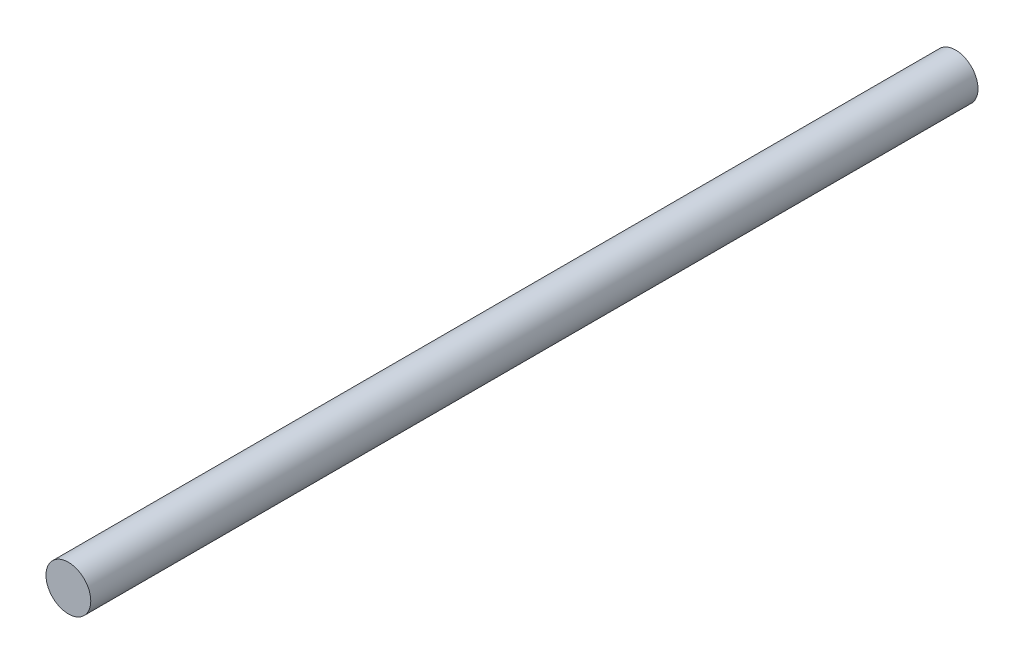
ISO-10303-21;
HEADER;
FILE_DESCRIPTION(('STEP AP214'),'2;1');
FILE_NAME('part.step','',(''),(''),'','','');
FILE_SCHEMA(('AUTOMOTIVE_DESIGN { 1 0 10303 214 1 1 1 1 }'));
ENDSEC;
DATA;
#1=APPLICATION_CONTEXT('core data for automotive mechanical design processes');
#2=APPLICATION_PROTOCOL_DEFINITION('international standard','automotive_design',2000,#1);
#3=PRODUCT_CONTEXT('',#1,'mechanical');
#4=PRODUCT('Part','Part','',(#3));
#5=PRODUCT_RELATED_PRODUCT_CATEGORY('part','',(#4));
#6=PRODUCT_DEFINITION_FORMATION('','',#4);
#7=PRODUCT_DEFINITION_CONTEXT('part definition',#1,'design');
#8=PRODUCT_DEFINITION('design','',#6,#7);
#9=PRODUCT_DEFINITION_SHAPE('','',#8);
#10=(LENGTH_UNIT() NAMED_UNIT(*) SI_UNIT(.MILLI.,.METRE.));
#11=(NAMED_UNIT(*) PLANE_ANGLE_UNIT() SI_UNIT($,.RADIAN.));
#12=(NAMED_UNIT(*) SI_UNIT($,.STERADIAN.) SOLID_ANGLE_UNIT());
#13=UNCERTAINTY_MEASURE_WITH_UNIT(LENGTH_MEASURE(1.E-05),#10,'distance_accuracy_value','');
#14=(GEOMETRIC_REPRESENTATION_CONTEXT(3) GLOBAL_UNCERTAINTY_ASSIGNED_CONTEXT((#13)) GLOBAL_UNIT_ASSIGNED_CONTEXT((#10,
#11,#12)) REPRESENTATION_CONTEXT('',''));
#15=CARTESIAN_POINT('',(0.,0.,0.));
#16=DIRECTION('',(0.,0.,1.));
#17=DIRECTION('',(1.,0.,0.));
#18=AXIS2_PLACEMENT_3D('',#15,#16,#17);
#19=CARTESIAN_POINT('',(0.,0.,-70.3804718998415));
#20=DIRECTION('',(0.,0.,1.));
#21=DIRECTION('',(1.,0.,0.));
#22=AXIS2_PLACEMENT_3D('',#19,#20,#21);
#23=CYLINDRICAL_SURFACE('',#22,1.778);
#24=CARTESIAN_POINT('',(0.,0.,-70.3804718998415));
#25=DIRECTION('',(0.,0.,1.));
#26=DIRECTION('',(1.,0.,0.));
#27=AXIS2_PLACEMENT_3D('',#24,#25,#26);
#28=CIRCLE('',#27,1.778);
#29=CARTESIAN_POINT('',(1.778,0.,-70.3804718998415));
#30=VERTEX_POINT('',#29);
#31=EDGE_CURVE('E11',#30,#30,#28,.T.);
#32=ORIENTED_EDGE('',*,*,#31,.T.);
#33=EDGE_LOOP('',(#32));
#34=FACE_BOUND('',#33,.T.);
#35=CARTESIAN_POINT('',(0.,0.,0.));
#36=DIRECTION('',(0.,0.,1.));
#37=DIRECTION('',(1.,0.,0.));
#38=AXIS2_PLACEMENT_3D('',#35,#36,#37);
#39=CIRCLE('',#38,1.778);
#40=CARTESIAN_POINT('',(1.778,0.,0.));
#41=VERTEX_POINT('',#40);
#42=EDGE_CURVE('E53',#41,#41,#39,.T.);
#43=ORIENTED_EDGE('',*,*,#42,.F.);
#44=EDGE_LOOP('',(#43));
#45=FACE_BOUND('',#44,.T.);
#46=ADVANCED_FACE('F50',(#34,#45),#23,.T.);
#47=CARTESIAN_POINT('',(0.,0.,-70.3804718998415));
#48=DIRECTION('',(0.,0.,1.));
#49=DIRECTION('',(1.,0.,0.));
#50=AXIS2_PLACEMENT_3D('',#47,#48,#49);
#51=PLANE('',#50);
#52=ORIENTED_EDGE('',*,*,#31,.F.);
#53=EDGE_LOOP('',(#52));
#54=FACE_BOUND('',#53,.T.);
#55=ADVANCED_FACE('F68',(#54),#51,.F.);
#56=CARTESIAN_POINT('',(0.,0.,0.));
#57=DIRECTION('',(0.,0.,1.));
#58=DIRECTION('',(1.,0.,0.));
#59=AXIS2_PLACEMENT_3D('',#56,#57,#58);
#60=PLANE('',#59);
#61=ORIENTED_EDGE('',*,*,#42,.T.);
#62=EDGE_LOOP('',(#61));
#63=FACE_BOUND('',#62,.T.);
#64=ADVANCED_FACE('F65',(#63),#60,.T.);
#65=CLOSED_SHELL('',(#46,#55,#64));
#66=MANIFOLD_SOLID_BREP('B2',#65);
#67=ADVANCED_BREP_SHAPE_REPRESENTATION('',(#18,#66),#14);
#68=SHAPE_DEFINITION_REPRESENTATION(#9,#67);
ENDSEC;
END-ISO-10303-21;
